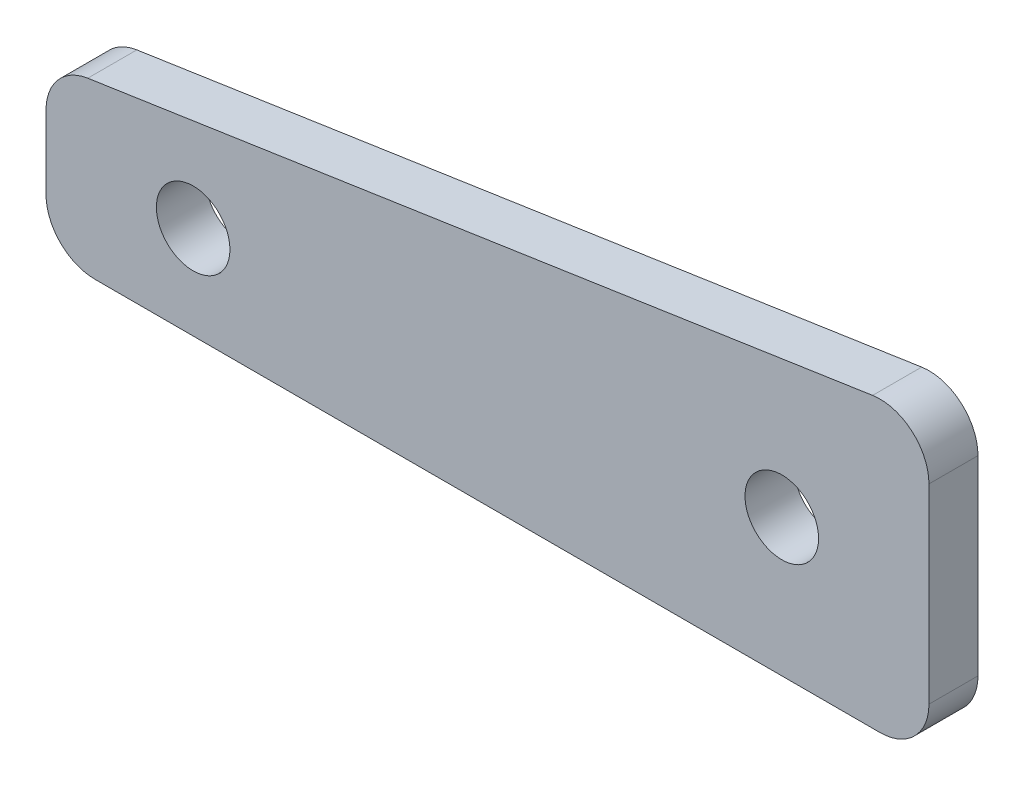
ISO-10303-21;
HEADER;
FILE_DESCRIPTION(('STEP AP214'),'2;1');
FILE_NAME('part.step','',(''),(''),'','','');
FILE_SCHEMA(('AUTOMOTIVE_DESIGN { 1 0 10303 214 1 1 1 1 }'));
ENDSEC;
DATA;
#1=APPLICATION_CONTEXT('core data for automotive mechanical design processes');
#2=APPLICATION_PROTOCOL_DEFINITION('international standard','automotive_design',2000,#1);
#3=PRODUCT_CONTEXT('',#1,'mechanical');
#4=PRODUCT('Part','Part','',(#3));
#5=PRODUCT_RELATED_PRODUCT_CATEGORY('part','',(#4));
#6=PRODUCT_DEFINITION_FORMATION('','',#4);
#7=PRODUCT_DEFINITION_CONTEXT('part definition',#1,'design');
#8=PRODUCT_DEFINITION('design','',#6,#7);
#9=PRODUCT_DEFINITION_SHAPE('','',#8);
#10=(LENGTH_UNIT() NAMED_UNIT(*) SI_UNIT(.MILLI.,.METRE.));
#11=(NAMED_UNIT(*) PLANE_ANGLE_UNIT() SI_UNIT($,.RADIAN.));
#12=(NAMED_UNIT(*) SI_UNIT($,.STERADIAN.) SOLID_ANGLE_UNIT());
#13=UNCERTAINTY_MEASURE_WITH_UNIT(LENGTH_MEASURE(1.E-05),#10,'distance_accuracy_value','');
#14=(GEOMETRIC_REPRESENTATION_CONTEXT(3) GLOBAL_UNCERTAINTY_ASSIGNED_CONTEXT((#13)) GLOBAL_UNIT_ASSIGNED_CONTEXT((#10,
#11,#12)) REPRESENTATION_CONTEXT('',''));
#15=CARTESIAN_POINT('',(0.,0.,0.));
#16=DIRECTION('',(0.,0.,1.));
#17=DIRECTION('',(1.,0.,0.));
#18=AXIS2_PLACEMENT_3D('',#15,#16,#17);
#19=CARTESIAN_POINT('',(-298.45,15.5219799389351,3.175));
#20=DIRECTION('',(0.,0.,-1.));
#21=DIRECTION('',(-1.,0.,0.));
#22=AXIS2_PLACEMENT_3D('',#19,#20,#21);
#23=CYLINDRICAL_SURFACE('',#22,3.17499999999999);
#24=CARTESIAN_POINT('',(-298.45,15.5219799389351,0.));
#25=DIRECTION('',(0.,0.,1.));
#26=DIRECTION('',(1.,0.,0.));
#27=AXIS2_PLACEMENT_3D('',#24,#25,#26);
#28=CIRCLE('',#27,3.17499999999999);
#29=CARTESIAN_POINT('',(-295.275,15.5219799389351,0.));
#30=VERTEX_POINT('',#29);
#31=CARTESIAN_POINT('',(-298.920980938054,18.6618528592919,0.));
#32=VERTEX_POINT('',#31);
#33=EDGE_CURVE('E133',#30,#32,#28,.T.);
#34=ORIENTED_EDGE('',*,*,#33,.T.);
#35=DIRECTION('',(0.,0.,-1.));
#36=VECTOR('',#35,1.);
#37=CARTESIAN_POINT('',(-298.920980938054,18.6618528592919,3.175));
#38=LINE('',#37,#36);
#39=CARTESIAN_POINT('',(-298.920980938054,18.6618528592919,3.175));
#40=VERTEX_POINT('',#39);
#41=EDGE_CURVE('E11',#40,#32,#38,.T.);
#42=ORIENTED_EDGE('',*,*,#41,.F.);
#43=CARTESIAN_POINT('',(-298.45,15.5219799389351,3.175));
#44=DIRECTION('',(0.,0.,1.));
#45=DIRECTION('',(1.,0.,0.));
#46=AXIS2_PLACEMENT_3D('',#43,#44,#45);
#47=CIRCLE('',#46,3.17499999999999);
#48=CARTESIAN_POINT('',(-295.275,15.5219799389351,3.175));
#49=VERTEX_POINT('',#48);
#50=EDGE_CURVE('E85',#49,#40,#47,.T.);
#51=ORIENTED_EDGE('',*,*,#50,.F.);
#52=DIRECTION('',(0.,0.,-1.));
#53=VECTOR('',#52,1.);
#54=CARTESIAN_POINT('',(-295.275,15.5219799389351,3.175));
#55=LINE('',#54,#53);
#56=EDGE_CURVE('E132',#49,#30,#55,.T.);
#57=ORIENTED_EDGE('',*,*,#56,.T.);
#58=EDGE_LOOP('',(#34,#42,#51,#57));
#59=FACE_BOUND('',#58,.T.);
#60=ADVANCED_FACE('F33',(#59),#23,.T.);
#61=CARTESIAN_POINT('',(-9.31540342298291,62.1026894865526,3.175));
#62=DIRECTION('',(-0.148340452930245,0.988936352868297,0.));
#63=DIRECTION('',(-0.988936352868298,-0.148340452930245,0.));
#64=AXIS2_PLACEMENT_3D('',#61,#62,#63);
#65=PLANE('',#64);
#66=DIRECTION('',(0.988936352868298,0.148340452930245,0.));
#67=VECTOR('',#66,1.);
#68=CARTESIAN_POINT('',(-9.31540342298291,62.1026894865526,0.));
#69=LINE('',#68,#67);
#70=CARTESIAN_POINT('',(-349.720980938053,11.0418528592919,0.));
#71=VERTEX_POINT('',#70);
#72=EDGE_CURVE('E136',#71,#32,#69,.T.);
#73=ORIENTED_EDGE('',*,*,#72,.F.);
#74=DIRECTION('',(0.,0.,-1.));
#75=VECTOR('',#74,1.);
#76=CARTESIAN_POINT('',(-349.720980938053,11.0418528592919,3.175));
#77=LINE('',#76,#75);
#78=CARTESIAN_POINT('',(-349.720980938053,11.0418528592919,3.175));
#79=VERTEX_POINT('',#78);
#80=EDGE_CURVE('E41',#79,#71,#77,.T.);
#81=ORIENTED_EDGE('',*,*,#80,.F.);
#82=DIRECTION('',(0.988936352868298,0.148340452930245,0.));
#83=VECTOR('',#82,1.);
#84=CARTESIAN_POINT('',(-9.31540342298291,62.1026894865526,3.175));
#85=LINE('',#84,#83);
#86=EDGE_CURVE('E190',#79,#40,#85,.T.);
#87=ORIENTED_EDGE('',*,*,#86,.T.);
#88=ORIENTED_EDGE('',*,*,#41,.T.);
#89=EDGE_LOOP('',(#73,#81,#87,#88));
#90=FACE_BOUND('',#89,.T.);
#91=ADVANCED_FACE('F173',(#90),#65,.T.);
#92=CARTESIAN_POINT('',(-349.25,7.90197993893509,3.175));
#93=DIRECTION('',(0.,0.,-1.));
#94=DIRECTION('',(-1.,0.,0.));
#95=AXIS2_PLACEMENT_3D('',#92,#93,#94);
#96=CYLINDRICAL_SURFACE('',#95,3.17499999999999);
#97=CARTESIAN_POINT('',(-349.25,7.90197993893509,0.));
#98=DIRECTION('',(0.,0.,1.));
#99=DIRECTION('',(1.,0.,0.));
#100=AXIS2_PLACEMENT_3D('',#97,#98,#99);
#101=CIRCLE('',#100,3.17499999999999);
#102=CARTESIAN_POINT('',(-352.425,7.90197993893507,0.));
#103=VERTEX_POINT('',#102);
#104=EDGE_CURVE('E139',#103,#71,#101,.F.);
#105=ORIENTED_EDGE('',*,*,#104,.F.);
#106=DIRECTION('',(0.,0.,-1.));
#107=VECTOR('',#106,1.);
#108=CARTESIAN_POINT('',(-352.425,7.90197993893507,3.175));
#109=LINE('',#108,#107);
#110=CARTESIAN_POINT('',(-352.425,7.90197993893507,3.175));
#111=VERTEX_POINT('',#110);
#112=EDGE_CURVE('E163',#111,#103,#109,.T.);
#113=ORIENTED_EDGE('',*,*,#112,.F.);
#114=CARTESIAN_POINT('',(-349.25,7.90197993893509,3.175));
#115=DIRECTION('',(0.,0.,1.));
#116=DIRECTION('',(1.,0.,0.));
#117=AXIS2_PLACEMENT_3D('',#114,#115,#116);
#118=CIRCLE('',#117,3.17499999999999);
#119=EDGE_CURVE('E170',#111,#79,#118,.F.);
#120=ORIENTED_EDGE('',*,*,#119,.T.);
#121=ORIENTED_EDGE('',*,*,#80,.T.);
#122=EDGE_LOOP('',(#105,#113,#120,#121));
#123=FACE_BOUND('',#122,.T.);
#124=ADVANCED_FACE('F168',(#123),#96,.T.);
#125=CARTESIAN_POINT('',(-352.425,0.,3.175));
#126=DIRECTION('',(1.,0.,0.));
#127=DIRECTION('',(0.,0.,-1.));
#128=AXIS2_PLACEMENT_3D('',#125,#126,#127);
#129=PLANE('',#128);
#130=DIRECTION('',(0.,-1.,0.));
#131=VECTOR('',#130,1.);
#132=CARTESIAN_POINT('',(-352.425,0.,0.));
#133=LINE('',#132,#131);
#134=CARTESIAN_POINT('',(-352.425,3.17499999999998,0.));
#135=VERTEX_POINT('',#134);
#136=EDGE_CURVE('E142',#103,#135,#133,.T.);
#137=ORIENTED_EDGE('',*,*,#136,.T.);
#138=DIRECTION('',(0.,0.,-1.));
#139=VECTOR('',#138,1.);
#140=CARTESIAN_POINT('',(-352.425,3.17499999999998,3.175));
#141=LINE('',#140,#139);
#142=CARTESIAN_POINT('',(-352.425,3.17499999999998,3.175));
#143=VERTEX_POINT('',#142);
#144=EDGE_CURVE('E160',#143,#135,#141,.T.);
#145=ORIENTED_EDGE('',*,*,#144,.F.);
#146=DIRECTION('',(0.,-1.,0.));
#147=VECTOR('',#146,1.);
#148=CARTESIAN_POINT('',(-352.425,0.,3.175));
#149=LINE('',#148,#147);
#150=EDGE_CURVE('E186',#111,#143,#149,.T.);
#151=ORIENTED_EDGE('',*,*,#150,.F.);
#152=ORIENTED_EDGE('',*,*,#112,.T.);
#153=EDGE_LOOP('',(#137,#145,#151,#152));
#154=FACE_BOUND('',#153,.T.);
#155=ADVANCED_FACE('F182',(#154),#129,.F.);
#156=CARTESIAN_POINT('',(-349.25,3.17499999999996,3.175));
#157=DIRECTION('',(0.,0.,-1.));
#158=DIRECTION('',(-1.,0.,0.));
#159=AXIS2_PLACEMENT_3D('',#156,#157,#158);
#160=CYLINDRICAL_SURFACE('',#159,3.17499999999999);
#161=CARTESIAN_POINT('',(-349.25,3.17499999999996,0.));
#162=DIRECTION('',(0.,0.,1.));
#163=DIRECTION('',(1.,0.,0.));
#164=AXIS2_PLACEMENT_3D('',#161,#162,#163);
#165=CIRCLE('',#164,3.17499999999999);
#166=CARTESIAN_POINT('',(-349.25,0.,0.));
#167=VERTEX_POINT('',#166);
#168=EDGE_CURVE('E144',#135,#167,#165,.T.);
#169=ORIENTED_EDGE('',*,*,#168,.T.);
#170=DIRECTION('',(0.,0.,-1.));
#171=VECTOR('',#170,1.);
#172=CARTESIAN_POINT('',(-349.25,0.,3.175));
#173=LINE('',#172,#171);
#174=CARTESIAN_POINT('',(-349.25,0.,3.175));
#175=VERTEX_POINT('',#174);
#176=EDGE_CURVE('E112',#175,#167,#173,.T.);
#177=ORIENTED_EDGE('',*,*,#176,.F.);
#178=CARTESIAN_POINT('',(-349.25,3.17499999999996,3.175));
#179=DIRECTION('',(0.,0.,1.));
#180=DIRECTION('',(1.,0.,0.));
#181=AXIS2_PLACEMENT_3D('',#178,#179,#180);
#182=CIRCLE('',#181,3.17499999999999);
#183=EDGE_CURVE('E118',#143,#175,#182,.T.);
#184=ORIENTED_EDGE('',*,*,#183,.F.);
#185=ORIENTED_EDGE('',*,*,#144,.T.);
#186=EDGE_LOOP('',(#169,#177,#184,#185));
#187=FACE_BOUND('',#186,.T.);
#188=ADVANCED_FACE('F185',(#187),#160,.T.);
#189=CARTESIAN_POINT('',(0.,0.,3.175));
#190=DIRECTION('',(0.,-1.,0.));
#191=DIRECTION('',(1.,0.,0.));
#192=AXIS2_PLACEMENT_3D('',#189,#190,#191);
#193=PLANE('',#192);
#194=DIRECTION('',(-1.,0.,0.));
#195=VECTOR('',#194,1.);
#196=CARTESIAN_POINT('',(0.,0.,0.));
#197=LINE('',#196,#195);
#198=CARTESIAN_POINT('',(-298.45,0.,0.));
#199=VERTEX_POINT('',#198);
#200=EDGE_CURVE('E107',#199,#167,#197,.T.);
#201=ORIENTED_EDGE('',*,*,#200,.F.);
#202=DIRECTION('',(0.,0.,-1.));
#203=VECTOR('',#202,1.);
#204=CARTESIAN_POINT('',(-298.45,0.,3.175));
#205=LINE('',#204,#203);
#206=CARTESIAN_POINT('',(-298.45,0.,3.175));
#207=VERTEX_POINT('',#206);
#208=EDGE_CURVE('E102',#207,#199,#205,.T.);
#209=ORIENTED_EDGE('',*,*,#208,.F.);
#210=DIRECTION('',(-1.,0.,0.));
#211=VECTOR('',#210,1.);
#212=CARTESIAN_POINT('',(0.,0.,3.175));
#213=LINE('',#212,#211);
#214=EDGE_CURVE('E105',#207,#175,#213,.T.);
#215=ORIENTED_EDGE('',*,*,#214,.T.);
#216=ORIENTED_EDGE('',*,*,#176,.T.);
#217=EDGE_LOOP('',(#201,#209,#215,#216));
#218=FACE_BOUND('',#217,.T.);
#219=ADVANCED_FACE('F104',(#218),#193,.T.);
#220=CARTESIAN_POINT('',(-298.45,3.17499999999996,3.175));
#221=DIRECTION('',(0.,0.,-1.));
#222=DIRECTION('',(-1.,0.,0.));
#223=AXIS2_PLACEMENT_3D('',#220,#221,#222);
#224=CYLINDRICAL_SURFACE('',#223,3.17499999999999);
#225=CARTESIAN_POINT('',(-298.45,3.17499999999996,0.));
#226=DIRECTION('',(0.,0.,1.));
#227=DIRECTION('',(1.,0.,0.));
#228=AXIS2_PLACEMENT_3D('',#225,#226,#227);
#229=CIRCLE('',#228,3.17499999999999);
#230=CARTESIAN_POINT('',(-295.275,3.17499999999999,0.));
#231=VERTEX_POINT('',#230);
#232=EDGE_CURVE('E148',#231,#199,#229,.F.);
#233=ORIENTED_EDGE('',*,*,#232,.F.);
#234=DIRECTION('',(0.,0.,-1.));
#235=VECTOR('',#234,1.);
#236=CARTESIAN_POINT('',(-295.275,3.17499999999999,3.175));
#237=LINE('',#236,#235);
#238=CARTESIAN_POINT('',(-295.275,3.17499999999999,3.175));
#239=VERTEX_POINT('',#238);
#240=EDGE_CURVE('E76',#239,#231,#237,.T.);
#241=ORIENTED_EDGE('',*,*,#240,.F.);
#242=CARTESIAN_POINT('',(-298.45,3.17499999999996,3.175));
#243=DIRECTION('',(0.,0.,1.));
#244=DIRECTION('',(1.,0.,0.));
#245=AXIS2_PLACEMENT_3D('',#242,#243,#244);
#246=CIRCLE('',#245,3.17499999999999);
#247=EDGE_CURVE('E116',#239,#207,#246,.F.);
#248=ORIENTED_EDGE('',*,*,#247,.T.);
#249=ORIENTED_EDGE('',*,*,#208,.T.);
#250=EDGE_LOOP('',(#233,#241,#248,#249));
#251=FACE_BOUND('',#250,.T.);
#252=ADVANCED_FACE('F121',(#251),#224,.T.);
#253=CARTESIAN_POINT('',(-342.9,6.03249999999891,3.175));
#254=DIRECTION('',(0.,0.,-1.));
#255=DIRECTION('',(-1.,0.,0.));
#256=AXIS2_PLACEMENT_3D('',#253,#254,#255);
#257=CYLINDRICAL_SURFACE('',#256,2.38125000000001);
#258=CARTESIAN_POINT('',(-342.9,6.03249999999891,3.175));
#259=DIRECTION('',(0.,0.,1.));
#260=DIRECTION('',(1.,0.,0.));
#261=AXIS2_PLACEMENT_3D('',#258,#259,#260);
#262=CIRCLE('',#261,2.38125000000001);
#263=CARTESIAN_POINT('',(-340.51875,6.03249999999891,3.175));
#264=VERTEX_POINT('',#263);
#265=EDGE_CURVE('E123',#264,#264,#262,.T.);
#266=ORIENTED_EDGE('',*,*,#265,.T.);
#267=EDGE_LOOP('',(#266));
#268=FACE_BOUND('',#267,.T.);
#269=CARTESIAN_POINT('',(-342.9,6.03249999999891,0.));
#270=DIRECTION('',(0.,0.,1.));
#271=DIRECTION('',(1.,0.,0.));
#272=AXIS2_PLACEMENT_3D('',#269,#270,#271);
#273=CIRCLE('',#272,2.38125000000001);
#274=CARTESIAN_POINT('',(-340.51875,6.03249999999891,0.));
#275=VERTEX_POINT('',#274);
#276=EDGE_CURVE('E151',#275,#275,#273,.T.);
#277=ORIENTED_EDGE('',*,*,#276,.F.);
#278=EDGE_LOOP('',(#277));
#279=FACE_BOUND('',#278,.T.);
#280=ADVANCED_FACE('F196',(#268,#279),#257,.F.);
#281=CARTESIAN_POINT('',(-295.275,0.,3.175));
#282=DIRECTION('',(-1.,0.,0.));
#283=DIRECTION('',(0.,0.,1.));
#284=AXIS2_PLACEMENT_3D('',#281,#282,#283);
#285=PLANE('',#284);
#286=DIRECTION('',(0.,1.,0.));
#287=VECTOR('',#286,1.);
#288=CARTESIAN_POINT('',(-295.275,0.,0.));
#289=LINE('',#288,#287);
#290=EDGE_CURVE('E79',#231,#30,#289,.T.);
#291=ORIENTED_EDGE('',*,*,#290,.T.);
#292=ORIENTED_EDGE('',*,*,#56,.F.);
#293=DIRECTION('',(0.,1.,0.));
#294=VECTOR('',#293,1.);
#295=CARTESIAN_POINT('',(-295.275,0.,3.175));
#296=LINE('',#295,#294);
#297=EDGE_CURVE('E49',#239,#49,#296,.T.);
#298=ORIENTED_EDGE('',*,*,#297,.F.);
#299=ORIENTED_EDGE('',*,*,#240,.T.);
#300=EDGE_LOOP('',(#291,#292,#298,#299));
#301=FACE_BOUND('',#300,.T.);
#302=ADVANCED_FACE('F193',(#301),#285,.F.);
#303=CARTESIAN_POINT('',(-304.8,8.88999999999905,3.175));
#304=DIRECTION('',(0.,0.,-1.));
#305=DIRECTION('',(-1.,0.,0.));
#306=AXIS2_PLACEMENT_3D('',#303,#304,#305);
#307=CYLINDRICAL_SURFACE('',#306,2.38125000000001);
#308=CARTESIAN_POINT('',(-304.8,8.88999999999905,3.175));
#309=DIRECTION('',(0.,0.,1.));
#310=DIRECTION('',(1.,0.,0.));
#311=AXIS2_PLACEMENT_3D('',#308,#309,#310);
#312=CIRCLE('',#311,2.38125000000001);
#313=CARTESIAN_POINT('',(-302.41875,8.88999999999905,3.175));
#314=VERTEX_POINT('',#313);
#315=EDGE_CURVE('E129',#314,#314,#312,.T.);
#316=ORIENTED_EDGE('',*,*,#315,.T.);
#317=EDGE_LOOP('',(#316));
#318=FACE_BOUND('',#317,.T.);
#319=CARTESIAN_POINT('',(-304.8,8.88999999999905,0.));
#320=DIRECTION('',(0.,0.,1.));
#321=DIRECTION('',(1.,0.,0.));
#322=AXIS2_PLACEMENT_3D('',#319,#320,#321);
#323=CIRCLE('',#322,2.38125000000001);
#324=CARTESIAN_POINT('',(-302.41875,8.88999999999905,0.));
#325=VERTEX_POINT('',#324);
#326=EDGE_CURVE('E154',#325,#325,#323,.T.);
#327=ORIENTED_EDGE('',*,*,#326,.F.);
#328=EDGE_LOOP('',(#327));
#329=FACE_BOUND('',#328,.T.);
#330=ADVANCED_FACE('F195',(#318,#329),#307,.F.);
#331=CARTESIAN_POINT('',(0.,0.,3.175));
#332=DIRECTION('',(0.,0.,1.));
#333=DIRECTION('',(1.,0.,0.));
#334=AXIS2_PLACEMENT_3D('',#331,#332,#333);
#335=PLANE('',#334);
#336=ORIENTED_EDGE('',*,*,#50,.T.);
#337=ORIENTED_EDGE('',*,*,#86,.F.);
#338=ORIENTED_EDGE('',*,*,#119,.F.);
#339=ORIENTED_EDGE('',*,*,#150,.T.);
#340=ORIENTED_EDGE('',*,*,#183,.T.);
#341=ORIENTED_EDGE('',*,*,#214,.F.);
#342=ORIENTED_EDGE('',*,*,#247,.F.);
#343=ORIENTED_EDGE('',*,*,#297,.T.);
#344=EDGE_LOOP('',(#336,#337,#338,#339,#340,#341,#342,#343));
#345=FACE_BOUND('',#344,.T.);
#346=ORIENTED_EDGE('',*,*,#265,.F.);
#347=EDGE_LOOP('',(#346));
#348=FACE_BOUND('',#347,.T.);
#349=ORIENTED_EDGE('',*,*,#315,.F.);
#350=EDGE_LOOP('',(#349));
#351=FACE_BOUND('',#350,.T.);
#352=ADVANCED_FACE('F114',(#345,#348,#351),#335,.T.);
#353=CARTESIAN_POINT('',(0.,0.,0.));
#354=DIRECTION('',(0.,0.,1.));
#355=DIRECTION('',(1.,0.,0.));
#356=AXIS2_PLACEMENT_3D('',#353,#354,#355);
#357=PLANE('',#356);
#358=ORIENTED_EDGE('',*,*,#33,.F.);
#359=ORIENTED_EDGE('',*,*,#290,.F.);
#360=ORIENTED_EDGE('',*,*,#232,.T.);
#361=ORIENTED_EDGE('',*,*,#200,.T.);
#362=ORIENTED_EDGE('',*,*,#168,.F.);
#363=ORIENTED_EDGE('',*,*,#136,.F.);
#364=ORIENTED_EDGE('',*,*,#104,.T.);
#365=ORIENTED_EDGE('',*,*,#72,.T.);
#366=EDGE_LOOP('',(#358,#359,#360,#361,#362,#363,#364,#365));
#367=FACE_BOUND('',#366,.T.);
#368=ORIENTED_EDGE('',*,*,#276,.T.);
#369=EDGE_LOOP('',(#368));
#370=FACE_BOUND('',#369,.T.);
#371=ORIENTED_EDGE('',*,*,#326,.T.);
#372=EDGE_LOOP('',(#371));
#373=FACE_BOUND('',#372,.T.);
#374=ADVANCED_FACE('F177',(#367,#370,#373),#357,.F.);
#375=CLOSED_SHELL('',(#60,#91,#124,#155,#188,#219,#252,#280,#302,#330,#352,#374));
#376=MANIFOLD_SOLID_BREP('B2',#375);
#377=ADVANCED_BREP_SHAPE_REPRESENTATION('',(#18,#376),#14);
#378=SHAPE_DEFINITION_REPRESENTATION(#9,#377);
ENDSEC;
END-ISO-10303-21;
